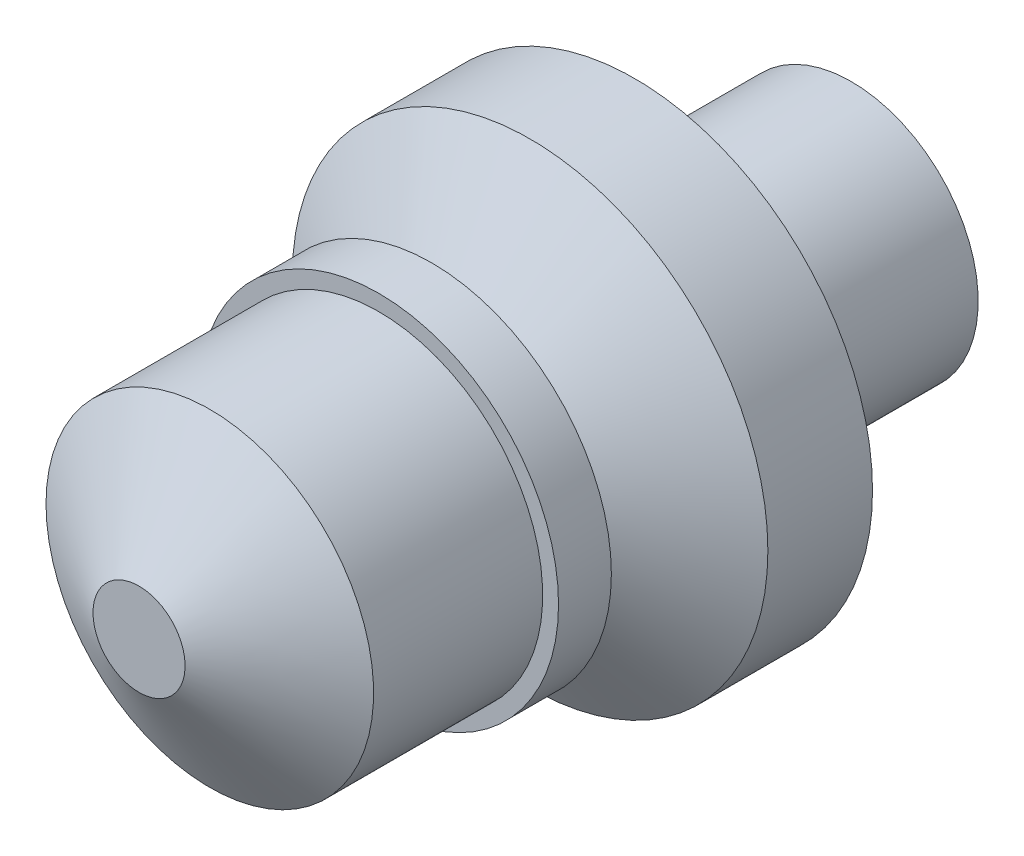
ISO-10303-21;
HEADER;
FILE_DESCRIPTION(('STEP AP214'),'2;1');
FILE_NAME('part.step','',(''),(''),'','','');
FILE_SCHEMA(('AUTOMOTIVE_DESIGN { 1 0 10303 214 1 1 1 1 }'));
ENDSEC;
DATA;
#1=APPLICATION_CONTEXT('core data for automotive mechanical design processes');
#2=APPLICATION_PROTOCOL_DEFINITION('international standard','automotive_design',2000,#1);
#3=PRODUCT_CONTEXT('',#1,'mechanical');
#4=PRODUCT('Part','Part','',(#3));
#5=PRODUCT_RELATED_PRODUCT_CATEGORY('part','',(#4));
#6=PRODUCT_DEFINITION_FORMATION('','',#4);
#7=PRODUCT_DEFINITION_CONTEXT('part definition',#1,'design');
#8=PRODUCT_DEFINITION('design','',#6,#7);
#9=PRODUCT_DEFINITION_SHAPE('','',#8);
#10=(LENGTH_UNIT() NAMED_UNIT(*) SI_UNIT(.MILLI.,.METRE.));
#11=(NAMED_UNIT(*) PLANE_ANGLE_UNIT() SI_UNIT($,.RADIAN.));
#12=(NAMED_UNIT(*) SI_UNIT($,.STERADIAN.) SOLID_ANGLE_UNIT());
#13=UNCERTAINTY_MEASURE_WITH_UNIT(LENGTH_MEASURE(1.E-05),#10,'distance_accuracy_value','');
#14=(GEOMETRIC_REPRESENTATION_CONTEXT(3) GLOBAL_UNCERTAINTY_ASSIGNED_CONTEXT((#13)) GLOBAL_UNIT_ASSIGNED_CONTEXT((#10,
#11,#12)) REPRESENTATION_CONTEXT('',''));
#15=CARTESIAN_POINT('',(0.,0.,0.));
#16=DIRECTION('',(0.,0.,1.));
#17=DIRECTION('',(1.,0.,0.));
#18=AXIS2_PLACEMENT_3D('',#15,#16,#17);
#19=CARTESIAN_POINT('',(89.6123055815697,0.,39.211102550928));
#20=DIRECTION('',(0.,0.,-1.));
#21=DIRECTION('',(-1.,0.,0.));
#22=AXIS2_PLACEMENT_3D('',#19,#20,#21);
#23=PLANE('',#22);
#24=CARTESIAN_POINT('',(75.1123055815697,0.,39.211102550928));
#25=DIRECTION('',(0.,0.,-1.));
#26=DIRECTION('',(-1.,0.,0.));
#27=AXIS2_PLACEMENT_3D('',#24,#25,#26);
#28=CIRCLE('',#27,17.);
#29=CARTESIAN_POINT('',(58.1123055815697,0.,39.211102550928));
#30=VERTEX_POINT('',#29);
#31=EDGE_CURVE('E10',#30,#30,#28,.T.);
#32=ORIENTED_EDGE('',*,*,#31,.T.);
#33=EDGE_LOOP('',(#32));
#34=FACE_BOUND('',#33,.T.);
#35=CARTESIAN_POINT('',(75.1123055815697,0.,39.211102550928));
#36=DIRECTION('',(0.,0.,-1.));
#37=DIRECTION('',(-1.,0.,0.));
#38=AXIS2_PLACEMENT_3D('',#35,#36,#37);
#39=CIRCLE('',#38,12.);
#40=CARTESIAN_POINT('',(63.1123055815697,0.,39.211102550928));
#41=VERTEX_POINT('',#40);
#42=EDGE_CURVE('E22',#41,#41,#39,.T.);
#43=ORIENTED_EDGE('',*,*,#42,.F.);
#44=EDGE_LOOP('',(#43));
#45=FACE_BOUND('',#44,.T.);
#46=ADVANCED_FACE('F16',(#34,#45),#23,.T.);
#47=CARTESIAN_POINT('',(75.1123055815697,0.,39.9419348686934));
#48=DIRECTION('',(0.,0.,-1.));
#49=DIRECTION('',(-1.,0.,0.));
#50=AXIS2_PLACEMENT_3D('',#47,#48,#49);
#51=CYLINDRICAL_SURFACE('',#50,17.);
#52=CARTESIAN_POINT('',(75.1123055815697,0.,44.211102550928));
#53=DIRECTION('',(0.,0.,-1.));
#54=DIRECTION('',(-1.,0.,0.));
#55=AXIS2_PLACEMENT_3D('',#52,#53,#54);
#56=CIRCLE('',#55,17.);
#57=CARTESIAN_POINT('',(58.1123055815697,0.,44.211102550928));
#58=VERTEX_POINT('',#57);
#59=EDGE_CURVE('E26',#58,#58,#56,.T.);
#60=ORIENTED_EDGE('',*,*,#59,.T.);
#61=EDGE_LOOP('',(#60));
#62=FACE_BOUND('',#61,.T.);
#63=ORIENTED_EDGE('',*,*,#31,.F.);
#64=EDGE_LOOP('',(#63));
#65=FACE_BOUND('',#64,.T.);
#66=ADVANCED_FACE('F156',(#62,#65),#51,.T.);
#67=CARTESIAN_POINT('',(91.3623055815697,0.,44.211102550928));
#68=DIRECTION('',(0.,0.,1.));
#69=DIRECTION('',(1.,0.,0.));
#70=AXIS2_PLACEMENT_3D('',#67,#68,#69);
#71=PLANE('',#70);
#72=CARTESIAN_POINT('',(75.1123055815697,0.,44.211102550928));
#73=DIRECTION('',(0.,0.,-1.));
#74=DIRECTION('',(-1.,0.,0.));
#75=AXIS2_PLACEMENT_3D('',#72,#73,#74);
#76=CIRCLE('',#75,15.5);
#77=CARTESIAN_POINT('',(59.6123055815697,0.,44.211102550928));
#78=VERTEX_POINT('',#77);
#79=EDGE_CURVE('E30',#78,#78,#76,.T.);
#80=ORIENTED_EDGE('',*,*,#79,.T.);
#81=EDGE_LOOP('',(#80));
#82=FACE_BOUND('',#81,.T.);
#83=ORIENTED_EDGE('',*,*,#59,.F.);
#84=EDGE_LOOP('',(#83));
#85=FACE_BOUND('',#84,.T.);
#86=ADVANCED_FACE('F153',(#82,#85),#71,.T.);
#87=CARTESIAN_POINT('',(75.1123055815697,0.,39.9419348686934));
#88=DIRECTION('',(0.,0.,-1.));
#89=DIRECTION('',(-1.,0.,0.));
#90=AXIS2_PLACEMENT_3D('',#87,#88,#89);
#91=CYLINDRICAL_SURFACE('',#90,15.5);
#92=CARTESIAN_POINT('',(75.1123055815697,0.,60.2111025509281));
#93=DIRECTION('',(0.,0.,-1.));
#94=DIRECTION('',(-1.,0.,0.));
#95=AXIS2_PLACEMENT_3D('',#92,#93,#94);
#96=CIRCLE('',#95,15.5);
#97=CARTESIAN_POINT('',(59.6123055815697,0.,60.2111025509281));
#98=VERTEX_POINT('',#97);
#99=EDGE_CURVE('E35',#98,#98,#96,.T.);
#100=ORIENTED_EDGE('',*,*,#99,.T.);
#101=EDGE_LOOP('',(#100));
#102=FACE_BOUND('',#101,.T.);
#103=ORIENTED_EDGE('',*,*,#79,.F.);
#104=EDGE_LOOP('',(#103));
#105=FACE_BOUND('',#104,.T.);
#106=ADVANCED_FACE('F149',(#102,#105),#91,.T.);
#107=CARTESIAN_POINT('',(75.1123055815697,0.,60.2111025509281));
#108=DIRECTION('',(0.,0.,-1.));
#109=DIRECTION('',(-1.,0.,0.));
#110=AXIS2_PLACEMENT_3D('',#107,#108,#109);
#111=CONICAL_SURFACE('',#110,15.5,1.02969680083775);
#112=CARTESIAN_POINT('',(75.1123055815697,0.,66.9071263482183));
#113=DIRECTION('',(0.,0.,-1.));
#114=DIRECTION('',(-1.,0.,0.));
#115=AXIS2_PLACEMENT_3D('',#112,#113,#114);
#116=CIRCLE('',#115,4.35714285714288);
#117=CARTESIAN_POINT('',(70.7551627244268,0.,66.9071263482183));
#118=VERTEX_POINT('',#117);
#119=EDGE_CURVE('E38',#118,#118,#116,.T.);
#120=CARTESIAN_POINT('',(70.7551627244268,0.,66.9071263482183));
#121=CARTESIAN_POINT('',(70.6390912958554,0.,66.8373761003299));
#122=CARTESIAN_POINT('',(70.523019867284,0.,66.7676258524414));
#123=CARTESIAN_POINT('',(70.2908770101411,0.,66.6281253566645));
#124=CARTESIAN_POINT('',(70.1748055815697,0.,66.5583751087761));
#125=CARTESIAN_POINT('',(69.9426627244268,0.,66.4188746129992));
#126=CARTESIAN_POINT('',(69.8265912958554,0.,66.3491243651108));
#127=CARTESIAN_POINT('',(69.5944484387126,0.,66.2096238693339));
#128=CARTESIAN_POINT('',(69.4783770101411,0.,66.1398736214455));
#129=CARTESIAN_POINT('',(69.2462341529983,0.,66.0003731256686));
#130=CARTESIAN_POINT('',(69.1301627244268,0.,65.9306228777802));
#131=CARTESIAN_POINT('',(68.898019867284,0.,65.7911223820033));
#132=CARTESIAN_POINT('',(68.7819484387125,0.,65.7213721341148));
#133=CARTESIAN_POINT('',(68.5498055815697,0.,65.581871638338));
#134=CARTESIAN_POINT('',(68.4337341529983,0.,65.5121213904495));
#135=CARTESIAN_POINT('',(68.2015912958554,0.,65.3726208946726));
#136=CARTESIAN_POINT('',(68.085519867284,0.,65.3028706467842));
#137=CARTESIAN_POINT('',(67.8533770101411,0.,65.1633701510073));
#138=CARTESIAN_POINT('',(67.7373055815697,0.,65.0936199031189));
#139=CARTESIAN_POINT('',(67.5051627244268,0.,64.954119407342));
#140=CARTESIAN_POINT('',(67.3890912958554,0.,64.8843691594536));
#141=CARTESIAN_POINT('',(67.1569484387125,0.,64.7448686636767));
#142=CARTESIAN_POINT('',(67.0408770101411,0.,64.6751184157882));
#143=CARTESIAN_POINT('',(66.8087341529983,0.,64.5356179200114));
#144=CARTESIAN_POINT('',(66.6926627244268,0.,64.4658676721229));
#145=CARTESIAN_POINT('',(66.460519867284,0.,64.326367176346));
#146=CARTESIAN_POINT('',(66.3444484387125,0.,64.2566169284576));
#147=CARTESIAN_POINT('',(66.1123055815697,0.,64.1171164326807));
#148=CARTESIAN_POINT('',(65.9962341529983,0.,64.0473661847923));
#149=CARTESIAN_POINT('',(65.7640912958554,0.,63.9078656890154));
#150=CARTESIAN_POINT('',(65.648019867284,0.,63.838115441127));
#151=CARTESIAN_POINT('',(65.4158770101411,0.,63.6986149453501));
#152=CARTESIAN_POINT('',(65.2998055815697,0.,63.6288646974616));
#153=CARTESIAN_POINT('',(65.0676627244268,0.,63.4893642016848));
#154=CARTESIAN_POINT('',(64.9515912958554,0.,63.4196139537963));
#155=CARTESIAN_POINT('',(64.7194484387125,0.,63.2801134580194));
#156=CARTESIAN_POINT('',(64.6033770101411,0.,63.210363210131));
#157=CARTESIAN_POINT('',(64.3712341529983,0.,63.0708627143541));
#158=CARTESIAN_POINT('',(64.2551627244268,0.,63.0011124664657));
#159=CARTESIAN_POINT('',(64.023019867284,0.,62.8616119706888));
#160=CARTESIAN_POINT('',(63.9069484387126,0.,62.7918617228004));
#161=CARTESIAN_POINT('',(63.6748055815697,0.,62.6523612270235));
#162=CARTESIAN_POINT('',(63.5587341529983,0.,62.582610979135));
#163=CARTESIAN_POINT('',(63.3265912958554,0.,62.4431104833582));
#164=CARTESIAN_POINT('',(63.210519867284,0.,62.3733602354697));
#165=CARTESIAN_POINT('',(62.9783770101411,0.,62.2338597396929));
#166=CARTESIAN_POINT('',(62.8623055815697,0.,62.1641094918044));
#167=CARTESIAN_POINT('',(62.6301627244268,0.,62.0246089960275));
#168=CARTESIAN_POINT('',(62.5140912958554,0.,61.9548587481391));
#169=CARTESIAN_POINT('',(62.2819484387126,0.,61.8153582523622));
#170=CARTESIAN_POINT('',(62.1658770101411,0.,61.7456080044738));
#171=CARTESIAN_POINT('',(61.9337341529983,0.,61.6061075086969));
#172=CARTESIAN_POINT('',(61.8176627244268,0.,61.5363572608085));
#173=CARTESIAN_POINT('',(61.585519867284,0.,61.3968567650316));
#174=CARTESIAN_POINT('',(61.4694484387126,0.,61.3271065171431));
#175=CARTESIAN_POINT('',(61.2373055815697,0.,61.1876060213663));
#176=CARTESIAN_POINT('',(61.1212341529983,0.,61.1178557734778));
#177=CARTESIAN_POINT('',(60.8890912958554,0.,60.9783552777009));
#178=CARTESIAN_POINT('',(60.773019867284,0.,60.9086050298125));
#179=CARTESIAN_POINT('',(60.5408770101411,0.,60.7691045340356));
#180=CARTESIAN_POINT('',(60.4248055815697,0.,60.6993542861472));
#181=CARTESIAN_POINT('',(60.1926627244268,0.,60.5598537903703));
#182=CARTESIAN_POINT('',(60.0765912958554,0.,60.4901035424819));
#183=CARTESIAN_POINT('',(59.8444484387126,0.,60.350603046705));
#184=CARTESIAN_POINT('',(59.7283770101411,0.,60.2808527988165));
#185=CARTESIAN_POINT('',(59.6123055815697,0.,60.2111025509281));
#186=B_SPLINE_CURVE_WITH_KNOTS('',3,(#120,#121,#122,#123,#124,#125,#126,#127,#128,#129,#130,
#131,#132,#133,#134,#135,#136,#137,#138,#139,#140,#141,#142,#143,#144,#145,#146,#147,#148,#149,
#150,#151,#152,#153,#154,#155,#156,#157,#158,#159,#160,#161,#162,#163,#164,#165,#166,#167,#168,
#169,#170,#171,#172,#173,#174,#175,#176,#177,#178,#179,#180,#181,#182,#183,#184,#185),
.UNSPECIFIED.,.F.,.F.,(4,2,2,2,2,2,2,2,2,2,2,2,2,2,2,2,2,2,2,2,2,2,2,2,2,2,2,2,2,2,2,2,4),(0.,
0.406249999999998,0.812499999999996,1.21874999999999,1.62499999999999,2.03125,2.43749999999999,
2.84375,3.24999999999998,3.65624999999998,4.06249999999998,4.46874999999999,4.87499999999998,
5.28124999999997,5.68749999999997,6.09374999999999,6.49999999999997,6.90624999999998,
7.31249999999997,7.71874999999998,8.12499999999996,8.53124999999997,8.93749999999996,
9.34374999999997,9.74999999999996,10.15625,10.5625,10.96875,11.375,11.78125,12.1875,12.59375,
13.),.UNSPECIFIED.);
#187=EDGE_CURVE('BSEAM145',#118,#98,#186,.T.);
#188=ORIENTED_EDGE('',*,*,#119,.T.);
#189=ORIENTED_EDGE('',*,*,#99,.F.);
#190=ORIENTED_EDGE('',*,*,#187,.T.);
#191=ORIENTED_EDGE('',*,*,#187,.F.);
#192=EDGE_LOOP('',(#188,#190,#189,#191));
#193=FACE_BOUND('',#192,.T.);
#194=ADVANCED_FACE('F145',(#193),#111,.T.);
#195=CARTESIAN_POINT('',(77.2908770101411,0.,66.9071263482183));
#196=DIRECTION('',(0.,0.,1.));
#197=DIRECTION('',(1.,0.,0.));
#198=AXIS2_PLACEMENT_3D('',#195,#196,#197);
#199=PLANE('',#198);
#200=ORIENTED_EDGE('',*,*,#119,.F.);
#201=EDGE_LOOP('',(#200));
#202=FACE_BOUND('',#201,.T.);
#203=ADVANCED_FACE('F141',(#202),#199,.T.);
#204=CARTESIAN_POINT('',(80.1123055815697,0.,20.));
#205=DIRECTION('',(0.,0.,1.));
#206=DIRECTION('',(1.,0.,0.));
#207=AXIS2_PLACEMENT_3D('',#204,#205,#206);
#208=PLANE('',#207);
#209=CARTESIAN_POINT('',(75.1123055815697,0.,20.));
#210=DIRECTION('',(0.,0.,-1.));
#211=DIRECTION('',(-1.,0.,0.));
#212=AXIS2_PLACEMENT_3D('',#209,#210,#211);
#213=CIRCLE('',#212,10.);
#214=CARTESIAN_POINT('',(65.1123055815697,0.,20.));
#215=VERTEX_POINT('',#214);
#216=EDGE_CURVE('E41',#215,#215,#213,.T.);
#217=ORIENTED_EDGE('',*,*,#216,.T.);
#218=EDGE_LOOP('',(#217));
#219=FACE_BOUND('',#218,.T.);
#220=ADVANCED_FACE('F137',(#219),#208,.F.);
#221=CARTESIAN_POINT('',(75.1123055815697,0.,39.9419348686934));
#222=DIRECTION('',(0.,0.,-1.));
#223=DIRECTION('',(-1.,0.,0.));
#224=AXIS2_PLACEMENT_3D('',#221,#222,#223);
#225=CYLINDRICAL_SURFACE('',#224,10.);
#226=ORIENTED_EDGE('',*,*,#216,.F.);
#227=EDGE_LOOP('',(#226));
#228=FACE_BOUND('',#227,.T.);
#229=CARTESIAN_POINT('',(75.1123055815697,0.,-0.5));
#230=DIRECTION('',(0.,0.,-1.));
#231=DIRECTION('',(-1.,0.,0.));
#232=AXIS2_PLACEMENT_3D('',#229,#230,#231);
#233=CIRCLE('',#232,10.);
#234=CARTESIAN_POINT('',(65.1123055815697,0.,-0.5));
#235=VERTEX_POINT('',#234);
#236=EDGE_CURVE('E44',#235,#235,#233,.T.);
#237=ORIENTED_EDGE('',*,*,#236,.T.);
#238=EDGE_LOOP('',(#237));
#239=FACE_BOUND('',#238,.T.);
#240=ADVANCED_FACE('F133',(#228,#239),#225,.F.);
#241=CARTESIAN_POINT('',(86.1123055815697,0.,-0.5));
#242=DIRECTION('',(0.,0.,-1.));
#243=DIRECTION('',(-1.,0.,0.));
#244=AXIS2_PLACEMENT_3D('',#241,#242,#243);
#245=PLANE('',#244);
#246=CARTESIAN_POINT('',(75.1123055815697,0.,-0.5));
#247=DIRECTION('',(0.,0.,-1.));
#248=DIRECTION('',(-1.,0.,0.));
#249=AXIS2_PLACEMENT_3D('',#246,#247,#248);
#250=CIRCLE('',#249,12.);
#251=CARTESIAN_POINT('',(63.1123055815697,0.,-0.5));
#252=VERTEX_POINT('',#251);
#253=EDGE_CURVE('E47',#252,#252,#250,.T.);
#254=ORIENTED_EDGE('',*,*,#253,.T.);
#255=EDGE_LOOP('',(#254));
#256=FACE_BOUND('',#255,.T.);
#257=ORIENTED_EDGE('',*,*,#236,.F.);
#258=EDGE_LOOP('',(#257));
#259=FACE_BOUND('',#258,.T.);
#260=ADVANCED_FACE('F129',(#256,#259),#245,.T.);
#261=CARTESIAN_POINT('',(75.1123055815697,0.,39.9419348686934));
#262=DIRECTION('',(0.,0.,-1.));
#263=DIRECTION('',(-1.,0.,0.));
#264=AXIS2_PLACEMENT_3D('',#261,#262,#263);
#265=CYLINDRICAL_SURFACE('',#264,12.);
#266=CARTESIAN_POINT('',(75.1123055815697,0.,20.));
#267=DIRECTION('',(0.,0.,-1.));
#268=DIRECTION('',(-1.,0.,0.));
#269=AXIS2_PLACEMENT_3D('',#266,#267,#268);
#270=CIRCLE('',#269,12.);
#271=CARTESIAN_POINT('',(63.1123055815697,0.,20.));
#272=VERTEX_POINT('',#271);
#273=EDGE_CURVE('E50',#272,#272,#270,.T.);
#274=ORIENTED_EDGE('',*,*,#273,.T.);
#275=EDGE_LOOP('',(#274));
#276=FACE_BOUND('',#275,.T.);
#277=ORIENTED_EDGE('',*,*,#253,.F.);
#278=EDGE_LOOP('',(#277));
#279=FACE_BOUND('',#278,.T.);
#280=ADVANCED_FACE('F125',(#276,#279),#265,.T.);
#281=CARTESIAN_POINT('',(92.3623055815697,0.,20.));
#282=DIRECTION('',(0.,0.,-1.));
#283=DIRECTION('',(-1.,0.,0.));
#284=AXIS2_PLACEMENT_3D('',#281,#282,#283);
#285=PLANE('',#284);
#286=CARTESIAN_POINT('',(75.1123055815697,0.,20.));
#287=DIRECTION('',(0.,0.,-1.));
#288=DIRECTION('',(-1.,0.,0.));
#289=AXIS2_PLACEMENT_3D('',#286,#287,#288);
#290=CIRCLE('',#289,22.5);
#291=CARTESIAN_POINT('',(52.6123055815697,0.,20.));
#292=VERTEX_POINT('',#291);
#293=EDGE_CURVE('E53',#292,#292,#290,.T.);
#294=ORIENTED_EDGE('',*,*,#293,.T.);
#295=EDGE_LOOP('',(#294));
#296=FACE_BOUND('',#295,.T.);
#297=ORIENTED_EDGE('',*,*,#273,.F.);
#298=EDGE_LOOP('',(#297));
#299=FACE_BOUND('',#298,.T.);
#300=ADVANCED_FACE('F121',(#296,#299),#285,.T.);
#301=CARTESIAN_POINT('',(75.1123055815697,0.,39.9419348686934));
#302=DIRECTION('',(0.,0.,-1.));
#303=DIRECTION('',(-1.,0.,0.));
#304=AXIS2_PLACEMENT_3D('',#301,#302,#303);
#305=CYLINDRICAL_SURFACE('',#304,22.5);
#306=CARTESIAN_POINT('',(75.1123055815697,0.,29.901387818866));
#307=DIRECTION('',(0.,0.,-1.));
#308=DIRECTION('',(-1.,0.,0.));
#309=AXIS2_PLACEMENT_3D('',#306,#307,#308);
#310=CIRCLE('',#309,22.5);
#311=CARTESIAN_POINT('',(52.6123055815697,0.,29.901387818866));
#312=VERTEX_POINT('',#311);
#313=EDGE_CURVE('E56',#312,#312,#310,.T.);
#314=ORIENTED_EDGE('',*,*,#313,.T.);
#315=EDGE_LOOP('',(#314));
#316=FACE_BOUND('',#315,.T.);
#317=ORIENTED_EDGE('',*,*,#293,.F.);
#318=EDGE_LOOP('',(#317));
#319=FACE_BOUND('',#318,.T.);
#320=ADVANCED_FACE('F117',(#316,#319),#305,.T.);
#321=CARTESIAN_POINT('',(75.1123055815697,0.,29.901387818866));
#322=DIRECTION('',(0.,0.,-1.));
#323=DIRECTION('',(-1.,0.,0.));
#324=AXIS2_PLACEMENT_3D('',#321,#322,#323);
#325=CONICAL_SURFACE('',#324,22.5,1.02969680083774);
#326=CARTESIAN_POINT('',(75.1123055815697,0.,36.211102550928));
#327=DIRECTION('',(0.,0.,-1.));
#328=DIRECTION('',(-1.,0.,0.));
#329=AXIS2_PLACEMENT_3D('',#326,#327,#328);
#330=CIRCLE('',#329,12.);
#331=CARTESIAN_POINT('',(63.1123055815697,0.,36.211102550928));
#332=VERTEX_POINT('',#331);
#333=EDGE_CURVE('E59',#332,#332,#330,.T.);
#334=ORIENTED_EDGE('',*,*,#333,.T.);
#335=EDGE_LOOP('',(#334));
#336=FACE_BOUND('',#335,.T.);
#337=ORIENTED_EDGE('',*,*,#313,.F.);
#338=EDGE_LOOP('',(#337));
#339=FACE_BOUND('',#338,.T.);
#340=ADVANCED_FACE('F114',(#336,#339),#325,.T.);
#341=CARTESIAN_POINT('',(75.1123055815697,0.,39.9419348686934));
#342=DIRECTION('',(0.,0.,-1.));
#343=DIRECTION('',(-1.,0.,0.));
#344=AXIS2_PLACEMENT_3D('',#341,#342,#343);
#345=CYLINDRICAL_SURFACE('',#344,12.);
#346=ORIENTED_EDGE('',*,*,#42,.T.);
#347=EDGE_LOOP('',(#346));
#348=FACE_BOUND('',#347,.T.);
#349=ORIENTED_EDGE('',*,*,#333,.F.);
#350=EDGE_LOOP('',(#349));
#351=FACE_BOUND('',#350,.T.);
#352=ADVANCED_FACE('F112',(#348,#351),#345,.T.);
#353=CLOSED_SHELL('',(#46,#66,#86,#106,#194,#203,#220,#240,#260,#280,#300,#320,#340,#352));
#354=CARTESIAN_POINT('',(77.2908770101411,0.,64.2663538455963));
#355=DIRECTION('',(0.,0.,-1.));
#356=DIRECTION('',(-1.,0.,0.));
#357=AXIS2_PLACEMENT_3D('',#354,#355,#356);
#358=PLANE('',#357);
#359=CARTESIAN_POINT('',(75.1123055815697,0.,64.2663538455963));
#360=DIRECTION('',(0.,0.,-1.));
#361=DIRECTION('',(-1.,0.,0.));
#362=AXIS2_PLACEMENT_3D('',#359,#360,#361);
#363=CIRCLE('',#362,4.35714285714289);
#364=CARTESIAN_POINT('',(70.7551627244268,0.,64.2663538455963));
#365=VERTEX_POINT('',#364);
#366=EDGE_CURVE('E62',#365,#365,#363,.T.);
#367=ORIENTED_EDGE('',*,*,#366,.T.);
#368=EDGE_LOOP('',(#367));
#369=FACE_BOUND('',#368,.T.);
#370=ADVANCED_FACE('F97',(#369),#358,.T.);
#371=CARTESIAN_POINT('',(75.1123055815697,0.,64.2663538455963));
#372=DIRECTION('',(0.,0.,-1.));
#373=DIRECTION('',(-1.,0.,0.));
#374=AXIS2_PLACEMENT_3D('',#371,#372,#373);
#375=CONICAL_SURFACE('',#374,4.35714285714289,1.02969680083775);
#376=CARTESIAN_POINT('',(75.1123055815697,0.,58.4949475444638));
#377=DIRECTION('',(0.,0.,-1.));
#378=DIRECTION('',(-1.,0.,0.));
#379=AXIS2_PLACEMENT_3D('',#376,#377,#378);
#380=CIRCLE('',#379,13.961343480344);
#381=CARTESIAN_POINT('',(61.1509621012257,0.,58.4949475444638));
#382=VERTEX_POINT('',#381);
#383=EDGE_CURVE('E65',#382,#382,#380,.T.);
#384=CARTESIAN_POINT('',(61.1509621012257,0.,58.4949475444638));
#385=CARTESIAN_POINT('',(61.2510058577174,0.,58.5550663601006));
#386=CARTESIAN_POINT('',(61.3510496142091,0.,58.6151851757374));
#387=CARTESIAN_POINT('',(61.5511371271924,0.,58.735422807011));
#388=CARTESIAN_POINT('',(61.6511808836841,0.,58.7955416226478));
#389=CARTESIAN_POINT('',(61.8512683966675,0.,58.9157792539214));
#390=CARTESIAN_POINT('',(61.9513121531592,0.,58.9758980695582));
#391=CARTESIAN_POINT('',(62.1513996661425,0.,59.0961357008318));
#392=CARTESIAN_POINT('',(62.2514434226342,0.,59.1562545164686));
#393=CARTESIAN_POINT('',(62.4515309356175,0.,59.2764921477422));
#394=CARTESIAN_POINT('',(62.5515746921092,0.,59.336610963379));
#395=CARTESIAN_POINT('',(62.7516622050926,0.,59.4568485946526));
#396=CARTESIAN_POINT('',(62.8517059615843,0.,59.5169674102893));
#397=CARTESIAN_POINT('',(63.0517934745676,0.,59.6372050415629));
#398=CARTESIAN_POINT('',(63.1518372310593,0.,59.6973238571997));
#399=CARTESIAN_POINT('',(63.3519247440426,0.,59.8175614884733));
#400=CARTESIAN_POINT('',(63.4519685005343,0.,59.8776803041101));
#401=CARTESIAN_POINT('',(63.6520560135177,0.,59.9979179353837));
#402=CARTESIAN_POINT('',(63.7520997700094,0.,60.0580367510205));
#403=CARTESIAN_POINT('',(63.9521872829927,0.,60.1782743822941));
#404=CARTESIAN_POINT('',(64.0522310394844,0.,60.2383931979309));
#405=CARTESIAN_POINT('',(64.2523185524678,0.,60.3586308292045));
#406=CARTESIAN_POINT('',(64.3523623089594,0.,60.4187496448413));
#407=CARTESIAN_POINT('',(64.5524498219428,0.,60.5389872761149));
#408=CARTESIAN_POINT('',(64.6524935784345,0.,60.5991060917517));
#409=CARTESIAN_POINT('',(64.8525810914178,0.,60.7193437230253));
#410=CARTESIAN_POINT('',(64.9526248479095,0.,60.7794625386621));
#411=CARTESIAN_POINT('',(65.1527123608929,0.,60.8997001699357));
#412=CARTESIAN_POINT('',(65.2527561173845,0.,60.9598189855725));
#413=CARTESIAN_POINT('',(65.4528436303679,0.,61.0800566168461));
#414=CARTESIAN_POINT('',(65.5528873868596,0.,61.1401754324829));
#415=CARTESIAN_POINT('',(65.7529748998429,0.,61.2604130637565));
#416=CARTESIAN_POINT('',(65.8530186563346,0.,61.3205318793933));
#417=CARTESIAN_POINT('',(66.053106169318,0.,61.4407695106669));
#418=CARTESIAN_POINT('',(66.1531499258096,0.,61.5008883263036));
#419=CARTESIAN_POINT('',(66.353237438793,0.,61.6211259575772));
#420=CARTESIAN_POINT('',(66.4532811952847,0.,61.681244773214));
#421=CARTESIAN_POINT('',(66.653368708268,0.,61.8014824044876));
#422=CARTESIAN_POINT('',(66.7534124647597,0.,61.8616012201244));
#423=CARTESIAN_POINT('',(66.953499977743,0.,61.981838851398));
#424=CARTESIAN_POINT('',(67.0535437342347,0.,62.0419576670348));
#425=CARTESIAN_POINT('',(67.2536312472181,0.,62.1621952983084));
#426=CARTESIAN_POINT('',(67.3536750037098,0.,62.2223141139452));
#427=CARTESIAN_POINT('',(67.5537625166931,0.,62.3425517452188));
#428=CARTESIAN_POINT('',(67.6538062731848,0.,62.4026705608556));
#429=CARTESIAN_POINT('',(67.8538937861682,0.,62.5229081921292));
#430=CARTESIAN_POINT('',(67.9539375426598,0.,62.583027007766));
#431=CARTESIAN_POINT('',(68.1540250556432,0.,62.7032646390396));
#432=CARTESIAN_POINT('',(68.2540688121349,0.,62.7633834546764));
#433=CARTESIAN_POINT('',(68.4541563251182,0.,62.88362108595));
#434=CARTESIAN_POINT('',(68.5542000816099,0.,62.9437399015868));
#435=CARTESIAN_POINT('',(68.7542875945933,0.,63.0639775328604));
#436=CARTESIAN_POINT('',(68.8543313510849,0.,63.1240963484972));
#437=CARTESIAN_POINT('',(69.0544188640683,0.,63.2443339797708));
#438=CARTESIAN_POINT('',(69.15446262056,0.,63.3044527954076));
#439=CARTESIAN_POINT('',(69.3545501335433,0.,63.4246904266811));
#440=CARTESIAN_POINT('',(69.454593890035,0.,63.4848092423179));
#441=CARTESIAN_POINT('',(69.6546814030184,0.,63.6050468735915));
#442=CARTESIAN_POINT('',(69.75472515951,0.,63.6651656892283));
#443=CARTESIAN_POINT('',(69.9548126724934,0.,63.7854033205019));
#444=CARTESIAN_POINT('',(70.0548564289851,0.,63.8455221361387));
#445=CARTESIAN_POINT('',(70.2549439419684,0.,63.9657597674123));
#446=CARTESIAN_POINT('',(70.3549876984601,0.,64.0258785830491));
#447=CARTESIAN_POINT('',(70.5550752114435,0.,64.1461162143227));
#448=CARTESIAN_POINT('',(70.6551189679351,0.,64.2062350299595));
#449=CARTESIAN_POINT('',(70.7551627244268,0.,64.2663538455963));
#450=B_SPLINE_CURVE_WITH_KNOTS('',3,(#384,#385,#386,#387,#388,#389,#390,#391,#392,#393,#394,
#395,#396,#397,#398,#399,#400,#401,#402,#403,#404,#405,#406,#407,#408,#409,#410,#411,#412,#413,
#414,#415,#416,#417,#418,#419,#420,#421,#422,#423,#424,#425,#426,#427,#428,#429,#430,#431,#432,
#433,#434,#435,#436,#437,#438,#439,#440,#441,#442,#443,#444,#445,#446,#447,#448,#449),
.UNSPECIFIED.,.F.,.F.,(4,2,2,2,2,2,2,2,2,2,2,2,2,2,2,2,2,2,2,2,2,2,2,2,2,2,2,2,2,2,2,2,4),(0.,
0.350153147720878,0.700306295441752,1.05045944316263,1.4006125908835,1.75076573860437,
2.10091888632525,2.45107203404612,2.801225181767,3.15137832948787,3.50153147720874,
3.85168462492962,4.20183777265049,4.55199092037137,4.90214406809224,5.25229721581312,
5.60245036353399,5.95260351125487,6.30275665897573,6.6529098066966,7.00306295441748,
7.35321610213835,7.70336924985923,8.0535223975801,8.40367554530098,8.75382869302185,
9.10398184074272,9.4541349884636,9.80428813618447,10.1544412839053,10.5045944316262,
10.8547475793471,11.204900727068),.UNSPECIFIED.);
#451=EDGE_CURVE('BSEAM100',#382,#365,#450,.T.);
#452=ORIENTED_EDGE('',*,*,#383,.T.);
#453=ORIENTED_EDGE('',*,*,#366,.F.);
#454=ORIENTED_EDGE('',*,*,#451,.T.);
#455=ORIENTED_EDGE('',*,*,#451,.F.);
#456=EDGE_LOOP('',(#452,#454,#453,#455));
#457=FACE_BOUND('',#456,.T.);
#458=ADVANCED_FACE('F100',(#457),#375,.F.);
#459=CARTESIAN_POINT('',(75.1123055815697,0.,39.9419348686934));
#460=DIRECTION('',(0.,0.,-1.));
#461=DIRECTION('',(-1.,0.,0.));
#462=AXIS2_PLACEMENT_3D('',#459,#460,#461);
#463=CYLINDRICAL_SURFACE('',#462,13.961343480344);
#464=CARTESIAN_POINT('',(75.1123055815697,0.,40.4486954212189));
#465=DIRECTION('',(0.,0.,-1.));
#466=DIRECTION('',(-1.,0.,0.));
#467=AXIS2_PLACEMENT_3D('',#464,#465,#466);
#468=CIRCLE('',#467,13.961343480344);
#469=CARTESIAN_POINT('',(61.1509621012257,0.,40.4486954212189));
#470=VERTEX_POINT('',#469);
#471=EDGE_CURVE('E68',#470,#470,#468,.T.);
#472=ORIENTED_EDGE('',*,*,#471,.T.);
#473=EDGE_LOOP('',(#472));
#474=FACE_BOUND('',#473,.T.);
#475=ORIENTED_EDGE('',*,*,#383,.F.);
#476=EDGE_LOOP('',(#475));
#477=FACE_BOUND('',#476,.T.);
#478=ADVANCED_FACE('F107',(#474,#477),#463,.F.);
#479=CARTESIAN_POINT('',(86.6749055749155,0.,40.4486954212189));
#480=DIRECTION('',(0.,0.,1.));
#481=DIRECTION('',(1.,0.,0.));
#482=AXIS2_PLACEMENT_3D('',#479,#480,#481);
#483=PLANE('',#482);
#484=CARTESIAN_POINT('',(75.1123055815697,0.,40.4486954212189));
#485=DIRECTION('',(0.,0.,-1.));
#486=DIRECTION('',(-1.,0.,0.));
#487=AXIS2_PLACEMENT_3D('',#484,#485,#486);
#488=CIRCLE('',#487,9.16385650634766);
#489=CARTESIAN_POINT('',(65.948449075222,0.,40.4486954212189));
#490=VERTEX_POINT('',#489);
#491=EDGE_CURVE('E71',#490,#490,#488,.T.);
#492=ORIENTED_EDGE('',*,*,#491,.T.);
#493=EDGE_LOOP('',(#492));
#494=FACE_BOUND('',#493,.T.);
#495=ORIENTED_EDGE('',*,*,#471,.F.);
#496=EDGE_LOOP('',(#495));
#497=FACE_BOUND('',#496,.T.);
#498=ADVANCED_FACE('F273',(#494,#497),#483,.T.);
#499=CARTESIAN_POINT('',(75.1123055815697,0.,39.9419348686934));
#500=DIRECTION('',(0.,0.,-1.));
#501=DIRECTION('',(-1.,0.,0.));
#502=AXIS2_PLACEMENT_3D('',#499,#500,#501);
#503=CYLINDRICAL_SURFACE('',#502,9.16385650634766);
#504=CARTESIAN_POINT('',(75.1123055815697,0.,34.1142117977142));
#505=DIRECTION('',(0.,0.,-1.));
#506=DIRECTION('',(-1.,0.,0.));
#507=AXIS2_PLACEMENT_3D('',#504,#505,#506);
#508=CIRCLE('',#507,9.16385650634766);
#509=CARTESIAN_POINT('',(65.948449075222,0.,34.1142117977142));
#510=VERTEX_POINT('',#509);
#511=EDGE_CURVE('E74',#510,#510,#508,.T.);
#512=ORIENTED_EDGE('',*,*,#511,.T.);
#513=EDGE_LOOP('',(#512));
#514=FACE_BOUND('',#513,.T.);
#515=ORIENTED_EDGE('',*,*,#491,.F.);
#516=EDGE_LOOP('',(#515));
#517=FACE_BOUND('',#516,.T.);
#518=ADVANCED_FACE('F282',(#514,#517),#503,.F.);
#519=CARTESIAN_POINT('',(75.1123055815697,0.,34.1142117977142));
#520=DIRECTION('',(0.,0.,-1.));
#521=DIRECTION('',(-1.,0.,0.));
#522=AXIS2_PLACEMENT_3D('',#519,#520,#521);
#523=CONICAL_SURFACE('',#522,9.16385650634766,1.02969680083775);
#524=CARTESIAN_POINT('',(75.1123055815697,0.,26.6384104670459));
#525=DIRECTION('',(0.,0.,-1.));
#526=DIRECTION('',(-1.,0.,0.));
#527=AXIS2_PLACEMENT_3D('',#524,#525,#526);
#528=CIRCLE('',#527,21.6043419015353);
#529=CARTESIAN_POINT('',(53.5079636800344,0.,26.6384104670459));
#530=VERTEX_POINT('',#529);
#531=EDGE_CURVE('E77',#530,#530,#528,.T.);
#532=ORIENTED_EDGE('',*,*,#531,.T.);
#533=EDGE_LOOP('',(#532));
#534=FACE_BOUND('',#533,.T.);
#535=ORIENTED_EDGE('',*,*,#511,.F.);
#536=EDGE_LOOP('',(#535));
#537=FACE_BOUND('',#536,.T.);
#538=ADVANCED_FACE('F95',(#534,#537),#523,.F.);
#539=CARTESIAN_POINT('',(75.1123055815697,0.,39.9419348686934));
#540=DIRECTION('',(0.,0.,-1.));
#541=DIRECTION('',(-1.,0.,0.));
#542=AXIS2_PLACEMENT_3D('',#539,#540,#541);
#543=CYLINDRICAL_SURFACE('',#542,21.6043419015353);
#544=CARTESIAN_POINT('',(75.1123055815697,0.,22.0786947757005));
#545=DIRECTION('',(0.,0.,-1.));
#546=DIRECTION('',(-1.,0.,0.));
#547=AXIS2_PLACEMENT_3D('',#544,#545,#546);
#548=CIRCLE('',#547,21.6043419015353);
#549=CARTESIAN_POINT('',(53.5079636800344,0.,22.0786947757005));
#550=VERTEX_POINT('',#549);
#551=EDGE_CURVE('E80',#550,#550,#548,.T.);
#552=ORIENTED_EDGE('',*,*,#551,.T.);
#553=EDGE_LOOP('',(#552));
#554=FACE_BOUND('',#553,.T.);
#555=ORIENTED_EDGE('',*,*,#531,.F.);
#556=EDGE_LOOP('',(#555));
#557=FACE_BOUND('',#556,.T.);
#558=ADVANCED_FACE('F84',(#554,#557),#543,.F.);
#559=CARTESIAN_POINT('',(85.9144765323373,0.,22.0786947757005));
#560=DIRECTION('',(0.,0.,1.));
#561=DIRECTION('',(1.,0.,0.));
#562=AXIS2_PLACEMENT_3D('',#559,#560,#561);
#563=PLANE('',#562);
#564=ORIENTED_EDGE('',*,*,#551,.F.);
#565=EDGE_LOOP('',(#564));
#566=FACE_BOUND('',#565,.T.);
#567=ADVANCED_FACE('F87',(#566),#563,.T.);
#568=CLOSED_SHELL('',(#370,#458,#478,#498,#518,#538,#558,#567));
#569=ORIENTED_CLOSED_SHELL('',*,#568,.T.);
#570=BREP_WITH_VOIDS('B1',#353,(#569));
#571=ADVANCED_BREP_SHAPE_REPRESENTATION('',(#18,#570),#14);
#572=SHAPE_DEFINITION_REPRESENTATION(#9,#571);
ENDSEC;
END-ISO-10303-21;
